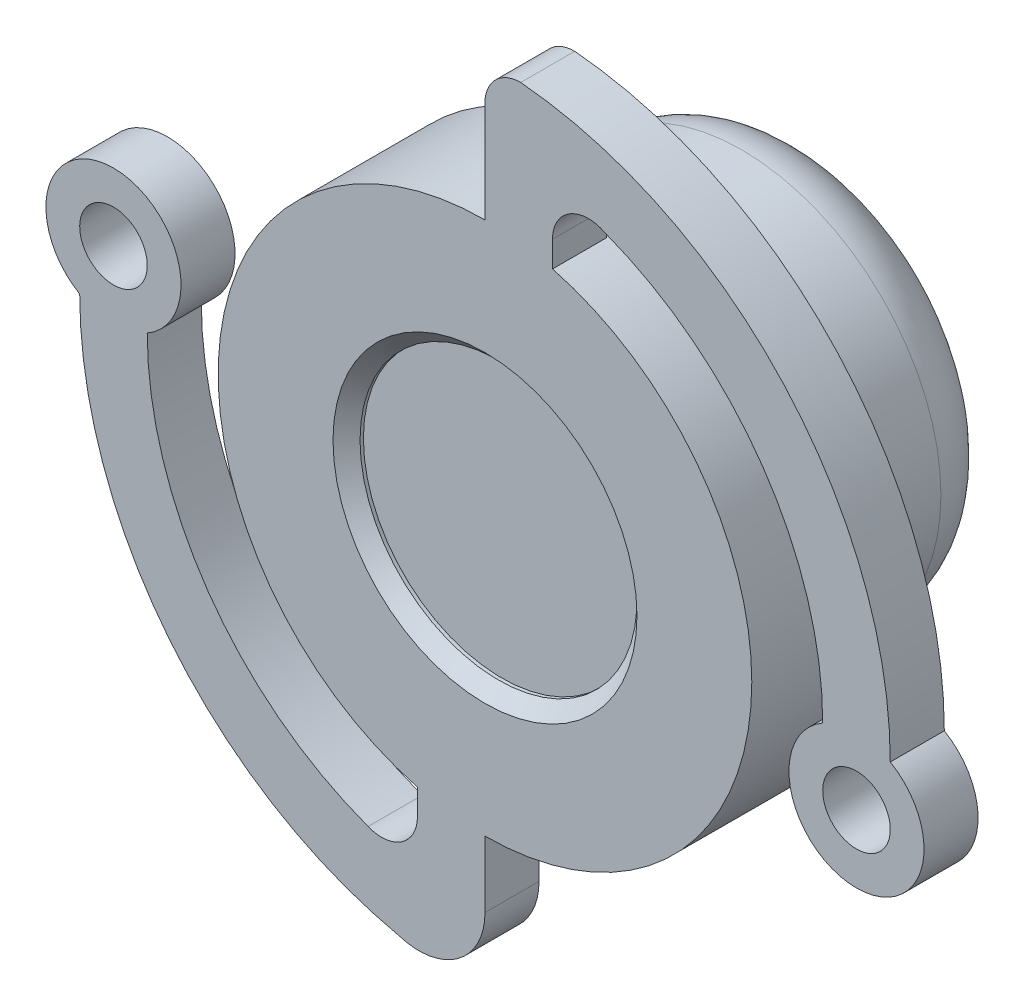
ISO-10303-21;
HEADER;
FILE_DESCRIPTION(('STEP AP214'),'2;1');
FILE_NAME('part.step','',(''),(''),'','','');
FILE_SCHEMA(('AUTOMOTIVE_DESIGN { 1 0 10303 214 1 1 1 1 }'));
ENDSEC;
DATA;
#1=APPLICATION_CONTEXT('core data for automotive mechanical design processes');
#2=APPLICATION_PROTOCOL_DEFINITION('international standard','automotive_design',2000,#1);
#3=PRODUCT_CONTEXT('',#1,'mechanical');
#4=PRODUCT('Part','Part','',(#3));
#5=PRODUCT_RELATED_PRODUCT_CATEGORY('part','',(#4));
#6=PRODUCT_DEFINITION_FORMATION('','',#4);
#7=PRODUCT_DEFINITION_CONTEXT('part definition',#1,'design');
#8=PRODUCT_DEFINITION('design','',#6,#7);
#9=PRODUCT_DEFINITION_SHAPE('','',#8);
#10=(LENGTH_UNIT() NAMED_UNIT(*) SI_UNIT(.MILLI.,.METRE.));
#11=(NAMED_UNIT(*) PLANE_ANGLE_UNIT() SI_UNIT($,.RADIAN.));
#12=(NAMED_UNIT(*) SI_UNIT($,.STERADIAN.) SOLID_ANGLE_UNIT());
#13=UNCERTAINTY_MEASURE_WITH_UNIT(LENGTH_MEASURE(1.E-05),#10,'distance_accuracy_value','');
#14=(GEOMETRIC_REPRESENTATION_CONTEXT(3) GLOBAL_UNCERTAINTY_ASSIGNED_CONTEXT((#13)) GLOBAL_UNIT_ASSIGNED_CONTEXT((#10,
#11,#12)) REPRESENTATION_CONTEXT('',''));
#15=CARTESIAN_POINT('',(0.,0.,0.));
#16=DIRECTION('',(0.,0.,1.));
#17=DIRECTION('',(1.,0.,0.));
#18=AXIS2_PLACEMENT_3D('',#15,#16,#17);
#19=CARTESIAN_POINT('',(12.966856851689,27.5174833037251,-8.12700712680798));
#20=DIRECTION('',(0.,1.31134157754799E-07,-1.));
#21=DIRECTION('',(-1.,0.,0.));
#22=AXIS2_PLACEMENT_3D('',#19,#20,#21);
#23=PLANE('',#22);
#24=CARTESIAN_POINT('',(12.966856851689,27.5174830414568,-8.12700712680801));
#25=DIRECTION('',(0.,-1.31134157754799E-07,1.));
#26=DIRECTION('',(-1.,0.,0.));
#27=AXIS2_PLACEMENT_3D('',#24,#25,#26);
#28=CIRCLE('',#27,2.95);
#29=CARTESIAN_POINT('',(15.916856851689,27.5174830414568,-8.12700712680801));
#30=VERTEX_POINT('',#29);
#31=EDGE_CURVE('E339',#30,#30,#28,.T.);
#32=ORIENTED_EDGE('',*,*,#31,.T.);
#33=EDGE_LOOP('',(#32));
#34=FACE_BOUND('',#33,.T.);
#35=CARTESIAN_POINT('',(12.966856851689,27.5174833037251,-8.12700712680798));
#36=DIRECTION('',(0.,1.31134157754799E-07,-1.));
#37=DIRECTION('',(-1.,0.,0.));
#38=AXIS2_PLACEMENT_3D('',#35,#36,#37);
#39=CIRCLE('',#38,3.95000001490116);
#40=CARTESIAN_POINT('',(16.9168568665902,27.5174833037251,-8.12700712680798));
#41=VERTEX_POINT('',#40);
#42=EDGE_CURVE('E350',#41,#41,#39,.T.);
#43=ORIENTED_EDGE('',*,*,#42,.T.);
#44=EDGE_LOOP('',(#43));
#45=FACE_BOUND('',#44,.T.);
#46=ADVANCED_FACE('F47',(#34,#45),#23,.T.);
#47=CARTESIAN_POINT('',(12.966856851689,27.5174831070239,-6.62700712680799));
#48=DIRECTION('',(0.,1.31134158346905E-07,-1.));
#49=DIRECTION('',(-1.,0.,0.));
#50=AXIS2_PLACEMENT_3D('',#47,#48,#49);
#51=CYLINDRICAL_SURFACE('',#50,3.95000001490116);
#52=DIRECTION('',(0.,-1.31134157754798E-07,0.999999999999992));
#53=VECTOR('',#52,1.);
#54=CARTESIAN_POINT('',(11.966856851689,23.6961613701041,-6.92700762791381));
#55=LINE('',#54,#53);
#56=CARTESIAN_POINT('',(11.966856851689,23.6961613701041,-6.92700762791381));
#57=VERTEX_POINT('',#56);
#58=CARTESIAN_POINT('',(11.966856851689,23.6961612651968,-6.12700762791382));
#59=VERTEX_POINT('',#58);
#60=EDGE_CURVE('E385',#57,#59,#55,.T.);
#61=ORIENTED_EDGE('',*,*,#60,.T.);
#62=CARTESIAN_POINT('',(12.966856851689,27.5174830414568,-6.127007126808));
#63=DIRECTION('',(0.,-1.31134157754799E-07,1.));
#64=DIRECTION('',(-1.,0.,0.));
#65=AXIS2_PLACEMENT_3D('',#62,#63,#64);
#66=CIRCLE('',#65,3.95000001490116);
#67=CARTESIAN_POINT('',(12.966856851689,31.4674830563579,-6.12700660882807));
#68=VERTEX_POINT('',#67);
#69=EDGE_CURVE('E363',#68,#59,#66,.T.);
#70=ORIENTED_EDGE('',*,*,#69,.F.);
#71=DIRECTION('',(0.,-1.31134157754798E-07,0.999999999999992));
#72=VECTOR('',#71,1.);
#73=CARTESIAN_POINT('',(12.966856851689,31.4674831612653,-6.92700660882807));
#74=LINE('',#73,#72);
#75=CARTESIAN_POINT('',(12.966856851689,31.4674831612653,-6.92700660882807));
#76=VERTEX_POINT('',#75);
#77=EDGE_CURVE('E311',#76,#68,#74,.T.);
#78=ORIENTED_EDGE('',*,*,#77,.F.);
#79=CARTESIAN_POINT('',(12.966856851689,27.5174831463641,-6.92700712680799));
#80=DIRECTION('',(0.,1.31134157754798E-07,-0.999999999999991));
#81=DIRECTION('',(0.,0.999999999999991,1.31134157754798E-07));
#82=AXIS2_PLACEMENT_3D('',#79,#80,#81);
#83=CIRCLE('',#82,3.95000001490124);
#84=CARTESIAN_POINT('',(13.966856851689,31.3388049226242,-6.92700662570218));
#85=VERTEX_POINT('',#84);
#86=EDGE_CURVE('E272',#76,#85,#83,.T.);
#87=ORIENTED_EDGE('',*,*,#86,.T.);
#88=DIRECTION('',(0.,-1.31134157754798E-07,0.999999999999992));
#89=VECTOR('',#88,1.);
#90=CARTESIAN_POINT('',(13.966856851689,31.3388049226242,-6.92700662570218));
#91=LINE('',#90,#89);
#92=CARTESIAN_POINT('',(13.966856851689,31.3388048177169,-6.12700662570219));
#93=VERTEX_POINT('',#92);
#94=EDGE_CURVE('E308',#85,#93,#91,.T.);
#95=ORIENTED_EDGE('',*,*,#94,.T.);
#96=CARTESIAN_POINT('',(16.9168568665902,27.5174830414568,-6.127007126808));
#97=VERTEX_POINT('',#96);
#98=EDGE_CURVE('E360',#97,#93,#66,.T.);
#99=ORIENTED_EDGE('',*,*,#98,.F.);
#100=DIRECTION('',(0.,-1.31134158346905E-07,1.));
#101=VECTOR('',#100,1.);
#102=CARTESIAN_POINT('',(16.9168568665902,27.5174831070239,-6.62700712680799));
#103=LINE('',#102,#101);
#104=EDGE_CURVE('E55',#41,#97,#103,.T.);
#105=ORIENTED_EDGE('',*,*,#104,.F.);
#106=ORIENTED_EDGE('',*,*,#42,.F.);
#107=ORIENTED_EDGE('',*,*,#104,.T.);
#108=CARTESIAN_POINT('',(12.9668568516884,23.5674830265556,-6.12700764478793));
#109=VERTEX_POINT('',#108);
#110=EDGE_CURVE('E359',#109,#97,#66,.T.);
#111=ORIENTED_EDGE('',*,*,#110,.F.);
#112=DIRECTION('',(0.,-1.31134157754798E-07,0.999999999999992));
#113=VECTOR('',#112,1.);
#114=CARTESIAN_POINT('',(12.966856851689,23.567483131463,-6.92700764478792));
#115=LINE('',#114,#113);
#116=CARTESIAN_POINT('',(12.966856851689,23.567483131463,-6.92700764478792));
#117=VERTEX_POINT('',#116);
#118=EDGE_CURVE('E388',#117,#109,#115,.T.);
#119=ORIENTED_EDGE('',*,*,#118,.F.);
#120=CARTESIAN_POINT('',(12.966856851689,27.5174831463641,-6.92700712680799));
#121=DIRECTION('',(0.,1.31134157754798E-07,-0.999999999999991));
#122=DIRECTION('',(0.,0.999999999999991,1.31134157754798E-07));
#123=AXIS2_PLACEMENT_3D('',#120,#121,#122);
#124=CIRCLE('',#123,3.95000001490116);
#125=EDGE_CURVE('E11',#57,#117,#124,.F.);
#126=ORIENTED_EDGE('',*,*,#125,.F.);
#127=EDGE_LOOP('',(#61,#70,#78,#87,#95,#99,#105,#106,#107,#111,#119,#126));
#128=FACE_BOUND('',#127,.T.);
#129=ADVANCED_FACE('F372',(#128),#51,.T.);
#130=CARTESIAN_POINT('',(12.966856851689,27.5174833233952,-6.37700712680796));
#131=DIRECTION('',(0.,-1.31134157754799E-07,1.));
#132=DIRECTION('',(-1.,0.,0.));
#133=AXIS2_PLACEMENT_3D('',#130,#131,#132);
#134=PLANE('',#133);
#135=CARTESIAN_POINT('',(12.966856851689,27.5174833233952,-6.37700712680796));
#136=DIRECTION('',(0.,1.31134157754799E-07,-1.));
#137=DIRECTION('',(1.,0.,0.));
#138=AXIS2_PLACEMENT_3D('',#135,#136,#137);
#139=CIRCLE('',#138,2.05);
#140=CARTESIAN_POINT('',(10.916856851689,27.5174833233952,-6.37700712680796));
#141=VERTEX_POINT('',#140);
#142=EDGE_CURVE('E322',#141,#141,#139,.T.);
#143=ORIENTED_EDGE('',*,*,#142,.F.);
#144=EDGE_LOOP('',(#143));
#145=FACE_BOUND('',#144,.T.);
#146=ADVANCED_FACE('F49',(#145),#134,.T.);
#147=CARTESIAN_POINT('',(12.966856851689,27.5174830414568,-6.127007126808));
#148=DIRECTION('',(0.,1.31134157754799E-07,-1.));
#149=DIRECTION('',(-1.,0.,0.));
#150=AXIS2_PLACEMENT_3D('',#147,#148,#149);
#151=PLANE('',#150);
#152=CARTESIAN_POINT('',(12.966856851689,27.5174832906117,-6.12700712680796));
#153=DIRECTION('',(0.,-1.31134157754799E-07,1.));
#154=DIRECTION('',(1.,0.,0.));
#155=AXIS2_PLACEMENT_3D('',#152,#153,#154);
#156=CIRCLE('',#155,2.25);
#157=CARTESIAN_POINT('',(10.716856851689,27.5174832906117,-6.12700712680796));
#158=VERTEX_POINT('',#157);
#159=EDGE_CURVE('E342',#158,#158,#156,.T.);
#160=ORIENTED_EDGE('',*,*,#159,.F.);
#161=EDGE_LOOP('',(#160));
#162=FACE_BOUND('',#161,.T.);
#163=ORIENTED_EDGE('',*,*,#69,.T.);
#164=DIRECTION('',(0.,-0.999999999999991,-1.3113415668214E-07));
#165=VECTOR('',#164,1.);
#166=CARTESIAN_POINT('',(11.966856851689,23.6961612651968,-6.12700762791382));
#167=LINE('',#166,#165);
#168=CARTESIAN_POINT('',(11.966856851689,23.3171314711586,-6.12700767761757));
#169=VERTEX_POINT('',#168);
#170=EDGE_CURVE('E228',#59,#169,#167,.T.);
#171=ORIENTED_EDGE('',*,*,#170,.T.);
#172=CARTESIAN_POINT('',(11.436856851689,23.3171314711586,-6.12700767761757));
#173=DIRECTION('',(0.,1.31134157754798E-07,-0.999999999999991));
#174=DIRECTION('',(0.,0.999999999999991,1.31134157754798E-07));
#175=AXIS2_PLACEMENT_3D('',#172,#173,#174);
#176=CIRCLE('',#175,0.53);
#177=CARTESIAN_POINT('',(11.2369889405969,22.8262620199644,-6.12700774198732));
#178=VERTEX_POINT('',#177);
#179=EDGE_CURVE('E225',#169,#178,#176,.T.);
#180=ORIENTED_EDGE('',*,*,#179,.T.);
#181=CARTESIAN_POINT('',(12.966856851689,27.5174832906117,-6.12700712680797));
#182=DIRECTION('',(0.,1.31134157754798E-07,-0.999999999999991));
#183=DIRECTION('',(0.,0.999999999999991,1.31134157754798E-07));
#184=AXIS2_PLACEMENT_3D('',#181,#182,#183);
#185=CIRCLE('',#184,5.00000000000001);
#186=CARTESIAN_POINT('',(7.96685685168899,27.5174832906117,-6.12700712680797));
#187=VERTEX_POINT('',#186);
#188=EDGE_CURVE('E218',#178,#187,#185,.T.);
#189=ORIENTED_EDGE('',*,*,#188,.T.);
#190=CARTESIAN_POINT('',(7.466856851689,28.3835086943961,-6.12700701324246));
#191=DIRECTION('',(0.,-1.31134157754798E-07,0.999999999999991));
#192=DIRECTION('',(0.,0.999999999999991,1.31134157754798E-07));
#193=AXIS2_PLACEMENT_3D('',#190,#191,#192);
#194=CIRCLE('',#193,0.999999999999999);
#195=CARTESIAN_POINT('',(6.966856851689,27.5174832906117,-6.12700712680797));
#196=VERTEX_POINT('',#195);
#197=EDGE_CURVE('E215',#187,#196,#194,.T.);
#198=ORIENTED_EDGE('',*,*,#197,.T.);
#199=CARTESIAN_POINT('',(12.966856851689,27.5174832906117,-6.12700712680797));
#200=DIRECTION('',(0.,-1.31134157754798E-07,0.999999999999991));
#201=DIRECTION('',(0.,0.999999999999991,1.31134157754798E-07));
#202=AXIS2_PLACEMENT_3D('',#199,#200,#201);
#203=CIRCLE('',#202,6.);
#204=CARTESIAN_POINT('',(11.6901438715171,21.6548896695034,-6.12700789559425));
#205=VERTEX_POINT('',#204);
#206=EDGE_CURVE('E197',#196,#205,#203,.T.);
#207=ORIENTED_EDGE('',*,*,#206,.T.);
#208=CARTESIAN_POINT('',(11.988315664118,22.5868963421565,-6.12700777337634));
#209=DIRECTION('',(0.,-1.31134157754798E-07,0.999999999999991));
#210=DIRECTION('',(0.,0.999999999999991,1.31134157754798E-07));
#211=AXIS2_PLACEMENT_3D('',#208,#209,#210);
#212=CIRCLE('',#211,0.978541187570968);
#213=CARTESIAN_POINT('',(12.966856851689,22.5868963421565,-6.12700777337634));
#214=VERTEX_POINT('',#213);
#215=EDGE_CURVE('E205',#205,#214,#212,.T.);
#216=ORIENTED_EDGE('',*,*,#215,.T.);
#217=DIRECTION('',(0.,0.999999999999991,1.3113415780958E-07));
#218=VECTOR('',#217,1.);
#219=CARTESIAN_POINT('',(12.966856851689,23.5674830265556,-6.12700764478793));
#220=LINE('',#219,#218);
#221=EDGE_CURVE('E62',#214,#109,#220,.T.);
#222=ORIENTED_EDGE('',*,*,#221,.T.);
#223=ORIENTED_EDGE('',*,*,#110,.T.);
#224=ORIENTED_EDGE('',*,*,#98,.T.);
#225=DIRECTION('',(0.,0.999999999999991,1.3113415812003E-07));
#226=VECTOR('',#225,1.);
#227=CARTESIAN_POINT('',(13.966856851689,31.3388048177169,-6.12700662570219));
#228=LINE('',#227,#226);
#229=CARTESIAN_POINT('',(13.966856851689,31.7208679756418,-6.12700657560066));
#230=VERTEX_POINT('',#229);
#231=EDGE_CURVE('E293',#93,#230,#228,.T.);
#232=ORIENTED_EDGE('',*,*,#231,.T.);
#233=CARTESIAN_POINT('',(14.496856851689,31.7208679756418,-6.12700657560066));
#234=DIRECTION('',(0.,1.31134157754798E-07,-0.999999999999991));
#235=DIRECTION('',(0.,0.999999999999991,1.31134157754798E-07));
#236=AXIS2_PLACEMENT_3D('',#233,#234,#235);
#237=CIRCLE('',#236,0.529999999999999);
#238=CARTESIAN_POINT('',(14.7345169129555,32.1945954239481,-6.12700651347881));
#239=VERTEX_POINT('',#238);
#240=EDGE_CURVE('E296',#230,#239,#237,.T.);
#241=ORIENTED_EDGE('',*,*,#240,.T.);
#242=CARTESIAN_POINT('',(12.966856851689,27.5174832906117,-6.12700712680797));
#243=DIRECTION('',(0.,1.31134157754798E-07,-0.999999999999991));
#244=DIRECTION('',(0.,-0.999999999999991,-1.31134157754798E-07));
#245=AXIS2_PLACEMENT_3D('',#242,#243,#244);
#246=CIRCLE('',#245,5.);
#247=CARTESIAN_POINT('',(17.966856851689,27.5174832906117,-6.12700712680797));
#248=VERTEX_POINT('',#247);
#249=EDGE_CURVE('E263',#239,#248,#246,.T.);
#250=ORIENTED_EDGE('',*,*,#249,.T.);
#251=CARTESIAN_POINT('',(18.466856851689,26.6514578868273,-6.12700724037348));
#252=DIRECTION('',(0.,-1.31134157754798E-07,0.999999999999991));
#253=DIRECTION('',(0.,-0.999999999999991,-1.31134157754798E-07));
#254=AXIS2_PLACEMENT_3D('',#251,#252,#253);
#255=CIRCLE('',#254,1.);
#256=CARTESIAN_POINT('',(18.966856851689,27.5174832906117,-6.12700712680797));
#257=VERTEX_POINT('',#256);
#258=EDGE_CURVE('E256',#248,#257,#255,.T.);
#259=ORIENTED_EDGE('',*,*,#258,.T.);
#260=CARTESIAN_POINT('',(12.966856851689,27.5174832906117,-6.12700712680797));
#261=DIRECTION('',(0.,-1.31134157754798E-07,0.999999999999991));
#262=DIRECTION('',(0.,0.999999999999991,1.31134157754798E-07));
#263=AXIS2_PLACEMENT_3D('',#260,#261,#262);
#264=CIRCLE('',#263,6.00000000000001);
#265=CARTESIAN_POINT('',(13.4958116735164,33.4941217100299,-6.12700634306652));
#266=VERTEX_POINT('',#265);
#267=EDGE_CURVE('E287',#257,#266,#264,.T.);
#268=ORIENTED_EDGE('',*,*,#267,.T.);
#269=CARTESIAN_POINT('',(13.4935005763374,32.967483056358,-6.12700641212684));
#270=DIRECTION('',(0.,-1.31134157754798E-07,0.999999999999991));
#271=DIRECTION('',(0.,0.999999999999991,1.31134157754798E-07));
#272=AXIS2_PLACEMENT_3D('',#269,#270,#271);
#273=CIRCLE('',#272,0.526643724648376);
#274=CARTESIAN_POINT('',(12.966856851689,32.967483056358,-6.12700641212684));
#275=VERTEX_POINT('',#274);
#276=EDGE_CURVE('E290',#266,#275,#273,.T.);
#277=ORIENTED_EDGE('',*,*,#276,.T.);
#278=DIRECTION('',(0.,-0.999999999999991,-1.31134157930572E-07));
#279=VECTOR('',#278,1.);
#280=CARTESIAN_POINT('',(12.966856851689,31.467483056358,-6.12700660882808));
#281=LINE('',#280,#279);
#282=EDGE_CURVE('E69',#275,#68,#281,.T.);
#283=ORIENTED_EDGE('',*,*,#282,.T.);
#284=EDGE_LOOP('',(#163,#171,#180,#189,#198,#207,#216,#222,#223,#224,#232,#241,#250,#259,#268,
#277,#283));
#285=FACE_BOUND('',#284,.T.);
#286=CARTESIAN_POINT('',(18.466856851689,26.6514578868273,-6.12700724037348));
#287=DIRECTION('',(0.,-1.31134157754798E-07,0.999999999999991));
#288=DIRECTION('',(0.,-0.999999999999991,-1.31134157754798E-07));
#289=AXIS2_PLACEMENT_3D('',#286,#287,#288);
#290=CIRCLE('',#289,0.500000000000003);
#291=CARTESIAN_POINT('',(18.466856851689,26.1514578868273,-6.12700730594056));
#292=VERTEX_POINT('',#291);
#293=EDGE_CURVE('E250',#292,#292,#290,.T.);
#294=ORIENTED_EDGE('',*,*,#293,.F.);
#295=EDGE_LOOP('',(#294));
#296=FACE_BOUND('',#295,.T.);
#297=CARTESIAN_POINT('',(7.466856851689,28.3835086943961,-6.12700701324246));
#298=DIRECTION('',(0.,-1.31134157754798E-07,0.999999999999991));
#299=DIRECTION('',(0.,-0.999999999999991,-1.31134157754798E-07));
#300=AXIS2_PLACEMENT_3D('',#297,#298,#299);
#301=CIRCLE('',#300,0.5);
#302=CARTESIAN_POINT('',(7.466856851689,27.8835086943961,-6.12700707880954));
#303=VERTEX_POINT('',#302);
#304=EDGE_CURVE('E247',#303,#303,#301,.T.);
#305=ORIENTED_EDGE('',*,*,#304,.F.);
#306=EDGE_LOOP('',(#305));
#307=FACE_BOUND('',#306,.T.);
#308=ADVANCED_FACE('F211',(#162,#285,#296,#307),#151,.F.);
#309=CARTESIAN_POINT('',(12.966856851689,27.5174832906117,-6.12700712680796));
#310=DIRECTION('',(0.,1.311341613075E-07,-1.));
#311=DIRECTION('',(1.,0.,0.));
#312=AXIS2_PLACEMENT_3D('',#309,#310,#311);
#313=CYLINDRICAL_SURFACE('',#312,2.05);
#314=CARTESIAN_POINT('',(12.966856851689,27.5174833168385,-6.32700712680796));
#315=DIRECTION('',(0.,1.31134157754799E-07,-1.));
#316=DIRECTION('',(1.,0.,0.));
#317=AXIS2_PLACEMENT_3D('',#314,#315,#316);
#318=CIRCLE('',#317,2.05);
#319=CARTESIAN_POINT('',(10.916856851689,27.5174833168385,-6.32700712680796));
#320=VERTEX_POINT('',#319);
#321=EDGE_CURVE('E323',#320,#320,#318,.T.);
#322=ORIENTED_EDGE('',*,*,#321,.F.);
#323=DIRECTION('',(0.,1.311341613075E-07,-1.));
#324=VECTOR('',#323,1.);
#325=CARTESIAN_POINT('',(10.916856851689,27.5174832906117,-6.12700712680796));
#326=LINE('',#325,#324);
#327=EDGE_CURVE('E318',#320,#141,#326,.T.);
#328=ORIENTED_EDGE('',*,*,#327,.T.);
#329=ORIENTED_EDGE('',*,*,#142,.T.);
#330=ORIENTED_EDGE('',*,*,#327,.F.);
#331=EDGE_LOOP('',(#322,#328,#329,#330));
#332=FACE_BOUND('',#331,.T.);
#333=ADVANCED_FACE('F442',(#332),#313,.F.);
#334=CARTESIAN_POINT('',(12.966856851689,27.5174833037251,-6.22700712680796));
#335=DIRECTION('',(0.,-1.31134147984824E-07,1.));
#336=DIRECTION('',(1.,0.,0.));
#337=AXIS2_PLACEMENT_3D('',#334,#335,#336);
#338=CONICAL_SURFACE('',#337,2.15,0.78539816339745);
#339=ORIENTED_EDGE('',*,*,#159,.T.);
#340=DIRECTION('',(0.707106781186548,9.27258453717848E-08,-0.707106781186541));
#341=VECTOR('',#340,1.);
#342=CARTESIAN_POINT('',(10.816856851689,27.5174833037251,-6.22700712680796));
#343=LINE('',#342,#341);
#344=EDGE_CURVE('E346',#158,#320,#343,.T.);
#345=ORIENTED_EDGE('',*,*,#344,.T.);
#346=ORIENTED_EDGE('',*,*,#321,.T.);
#347=ORIENTED_EDGE('',*,*,#344,.F.);
#348=EDGE_LOOP('',(#339,#345,#346,#347));
#349=FACE_BOUND('',#348,.T.);
#350=ADVANCED_FACE('F439',(#349),#338,.F.);
#351=CARTESIAN_POINT('',(12.966856851689,27.5174834086325,-10.927007126808));
#352=DIRECTION('',(0.,1.31134157754799E-07,-1.));
#353=DIRECTION('',(-1.,0.,0.));
#354=AXIS2_PLACEMENT_3D('',#351,#352,#353);
#355=PLANE('',#354);
#356=CARTESIAN_POINT('',(12.966856851689,27.5174834086325,-10.927007126808));
#357=DIRECTION('',(0.,-1.31134157754799E-07,1.));
#358=DIRECTION('',(-1.,0.,0.));
#359=AXIS2_PLACEMENT_3D('',#356,#357,#358);
#360=CIRCLE('',#359,1.95);
#361=CARTESIAN_POINT('',(14.916856851689,27.5174834086325,-10.927007126808));
#362=VERTEX_POINT('',#361);
#363=EDGE_CURVE('E303',#362,#362,#360,.T.);
#364=ORIENTED_EDGE('',*,*,#363,.F.);
#365=EDGE_LOOP('',(#364));
#366=FACE_BOUND('',#365,.T.);
#367=ADVANCED_FACE('F437',(#366),#355,.T.);
#368=CARTESIAN_POINT('',(12.966856851689,27.5174830414568,-8.12700712680801));
#369=DIRECTION('',(0.,1.31134157501021E-07,-1.));
#370=DIRECTION('',(-1.,0.,0.));
#371=AXIS2_PLACEMENT_3D('',#368,#369,#370);
#372=CYLINDRICAL_SURFACE('',#371,2.95);
#373=CARTESIAN_POINT('',(12.966856851689,27.5174832774983,-9.927007126808));
#374=DIRECTION('',(0.,1.31134157754799E-07,-1.));
#375=DIRECTION('',(-1.,0.,0.));
#376=AXIS2_PLACEMENT_3D('',#373,#374,#375);
#377=CIRCLE('',#376,2.95);
#378=CARTESIAN_POINT('',(15.916856851689,27.5174832774983,-9.927007126808));
#379=VERTEX_POINT('',#378);
#380=EDGE_CURVE('E331',#379,#379,#377,.T.);
#381=ORIENTED_EDGE('',*,*,#380,.F.);
#382=DIRECTION('',(0.,-1.31134157501021E-07,1.));
#383=VECTOR('',#382,1.);
#384=CARTESIAN_POINT('',(15.916856851689,27.5174830414568,-8.12700712680801));
#385=LINE('',#384,#383);
#386=EDGE_CURVE('E335',#379,#30,#385,.T.);
#387=ORIENTED_EDGE('',*,*,#386,.T.);
#388=ORIENTED_EDGE('',*,*,#31,.F.);
#389=ORIENTED_EDGE('',*,*,#386,.F.);
#390=EDGE_LOOP('',(#381,#387,#388,#389));
#391=FACE_BOUND('',#390,.T.);
#392=ADVANCED_FACE('F434',(#391),#372,.T.);
#393=CARTESIAN_POINT('',(12.966856851689,27.5174832774983,-9.927007126808));
#394=DIRECTION('',(0.,1.31134157754799E-07,-1.));
#395=DIRECTION('',(-1.,0.,0.));
#396=AXIS2_PLACEMENT_3D('',#393,#394,#395);
#397=TOROIDAL_SURFACE('',#396,1.95,1.);
#398=ORIENTED_EDGE('',*,*,#363,.T.);
#399=CARTESIAN_POINT('',(14.916856851689,27.5174832774983,-9.927007126808));
#400=DIRECTION('',(0.,-1.,-1.31134157754799E-07));
#401=DIRECTION('',(1.,0.,0.));
#402=AXIS2_PLACEMENT_3D('',#399,#400,#401);
#403=CIRCLE('',#402,1.);
#404=EDGE_CURVE('E327',#362,#379,#403,.T.);
#405=ORIENTED_EDGE('',*,*,#404,.T.);
#406=ORIENTED_EDGE('',*,*,#380,.T.);
#407=ORIENTED_EDGE('',*,*,#404,.F.);
#408=EDGE_LOOP('',(#398,#405,#406,#407));
#409=FACE_BOUND('',#408,.T.);
#410=ADVANCED_FACE('F432',(#409),#397,.T.);
#411=CARTESIAN_POINT('',(18.466856851689,26.6514579917346,-6.92700724037348));
#412=DIRECTION('',(0.,-1.31134157754798E-07,0.999999999999992));
#413=DIRECTION('',(0.,-0.999999999999992,-1.31134157754798E-07));
#414=AXIS2_PLACEMENT_3D('',#411,#412,#413);
#415=CYLINDRICAL_SURFACE('',#414,1.);
#416=ORIENTED_EDGE('',*,*,#258,.F.);
#417=DIRECTION('',(0.,-1.31134157754798E-07,0.999999999999992));
#418=VECTOR('',#417,1.);
#419=CARTESIAN_POINT('',(17.966856851689,27.517483395519,-6.92700712680796));
#420=LINE('',#419,#418);
#421=CARTESIAN_POINT('',(17.966856851689,27.517483395519,-6.92700712680796));
#422=VERTEX_POINT('',#421);
#423=EDGE_CURVE('E301',#422,#248,#420,.T.);
#424=ORIENTED_EDGE('',*,*,#423,.F.);
#425=CARTESIAN_POINT('',(18.466856851689,26.6514579917346,-6.92700724037348));
#426=DIRECTION('',(0.,-1.31134157754798E-07,0.999999999999991));
#427=DIRECTION('',(0.,-0.999999999999991,-1.31134157754798E-07));
#428=AXIS2_PLACEMENT_3D('',#425,#426,#427);
#429=CIRCLE('',#428,1.);
#430=CARTESIAN_POINT('',(18.966856851689,27.517483395519,-6.92700712680796));
#431=VERTEX_POINT('',#430);
#432=EDGE_CURVE('E259',#422,#431,#429,.T.);
#433=ORIENTED_EDGE('',*,*,#432,.T.);
#434=DIRECTION('',(0.,-1.31134157754798E-07,0.999999999999992));
#435=VECTOR('',#434,1.);
#436=CARTESIAN_POINT('',(18.966856851689,27.517483395519,-6.92700712680796));
#437=LINE('',#436,#435);
#438=EDGE_CURVE('E284',#431,#257,#437,.T.);
#439=ORIENTED_EDGE('',*,*,#438,.T.);
#440=EDGE_LOOP('',(#416,#424,#433,#439));
#441=FACE_BOUND('',#440,.T.);
#442=ADVANCED_FACE('F497',(#441),#415,.T.);
#443=CARTESIAN_POINT('',(12.966856851689,27.517483395519,-6.92700712680796));
#444=DIRECTION('',(0.,-1.31134157754798E-07,0.999999999999992));
#445=DIRECTION('',(0.,-0.999999999999992,-1.31134157754798E-07));
#446=AXIS2_PLACEMENT_3D('',#443,#444,#445);
#447=CYLINDRICAL_SURFACE('',#446,5.);
#448=ORIENTED_EDGE('',*,*,#249,.F.);
#449=DIRECTION('',(0.,-1.31134157754798E-07,0.999999999999992));
#450=VECTOR('',#449,1.);
#451=CARTESIAN_POINT('',(14.7345169129555,32.1945955288555,-6.9270065134788));
#452=LINE('',#451,#450);
#453=CARTESIAN_POINT('',(14.7345169129555,32.1945955288555,-6.9270065134788));
#454=VERTEX_POINT('',#453);
#455=EDGE_CURVE('E304',#454,#239,#452,.T.);
#456=ORIENTED_EDGE('',*,*,#455,.F.);
#457=CARTESIAN_POINT('',(12.966856851689,27.517483395519,-6.92700712680796));
#458=DIRECTION('',(0.,1.31134157754798E-07,-0.999999999999991));
#459=DIRECTION('',(0.,-0.999999999999991,-1.31134157754798E-07));
#460=AXIS2_PLACEMENT_3D('',#457,#458,#459);
#461=CIRCLE('',#460,5.);
#462=EDGE_CURVE('E281',#454,#422,#461,.T.);
#463=ORIENTED_EDGE('',*,*,#462,.T.);
#464=ORIENTED_EDGE('',*,*,#423,.T.);
#465=EDGE_LOOP('',(#448,#456,#463,#464));
#466=FACE_BOUND('',#465,.T.);
#467=ADVANCED_FACE('F602',(#466),#447,.F.);
#468=CARTESIAN_POINT('',(14.496856851689,31.7208680805492,-6.92700657560065));
#469=DIRECTION('',(0.,-1.31134157754798E-07,0.999999999999992));
#470=DIRECTION('',(0.,-0.999999999999992,-1.31134157754798E-07));
#471=AXIS2_PLACEMENT_3D('',#468,#469,#470);
#472=CYLINDRICAL_SURFACE('',#471,0.529999999999999);
#473=ORIENTED_EDGE('',*,*,#240,.F.);
#474=DIRECTION('',(0.,-1.31134157754798E-07,0.999999999999992));
#475=VECTOR('',#474,1.);
#476=CARTESIAN_POINT('',(13.966856851689,31.7208680805492,-6.92700657560065));
#477=LINE('',#476,#475);
#478=CARTESIAN_POINT('',(13.966856851689,31.7208680805492,-6.92700657560065));
#479=VERTEX_POINT('',#478);
#480=EDGE_CURVE('E306',#479,#230,#477,.T.);
#481=ORIENTED_EDGE('',*,*,#480,.F.);
#482=CARTESIAN_POINT('',(14.496856851689,31.7208680805492,-6.92700657560065));
#483=DIRECTION('',(0.,1.31134157754798E-07,-0.999999999999991));
#484=DIRECTION('',(0.,0.999999999999991,1.31134157754798E-07));
#485=AXIS2_PLACEMENT_3D('',#482,#483,#484);
#486=CIRCLE('',#485,0.529999999999999);
#487=EDGE_CURVE('E278',#479,#454,#486,.T.);
#488=ORIENTED_EDGE('',*,*,#487,.T.);
#489=ORIENTED_EDGE('',*,*,#455,.T.);
#490=EDGE_LOOP('',(#473,#481,#488,#489));
#491=FACE_BOUND('',#490,.T.);
#492=ADVANCED_FACE('F612',(#491),#472,.F.);
#493=CARTESIAN_POINT('',(13.966856851689,31.3388049226242,-6.92700662570218));
#494=DIRECTION('',(1.,0.,0.));
#495=DIRECTION('',(0.,0.,-1.));
#496=AXIS2_PLACEMENT_3D('',#493,#494,#495);
#497=PLANE('',#496);
#498=ORIENTED_EDGE('',*,*,#231,.F.);
#499=ORIENTED_EDGE('',*,*,#94,.F.);
#500=DIRECTION('',(0.,0.999999999999991,1.3113415812003E-07));
#501=VECTOR('',#500,1.);
#502=CARTESIAN_POINT('',(13.966856851689,31.3388049226242,-6.92700662570218));
#503=LINE('',#502,#501);
#504=EDGE_CURVE('E275',#85,#479,#503,.T.);
#505=ORIENTED_EDGE('',*,*,#504,.T.);
#506=ORIENTED_EDGE('',*,*,#480,.T.);
#507=EDGE_LOOP('',(#498,#499,#505,#506));
#508=FACE_BOUND('',#507,.T.);
#509=ADVANCED_FACE('F622',(#508),#497,.T.);
#510=CARTESIAN_POINT('',(12.966856851689,31.4674831612653,-6.92700660882807));
#511=DIRECTION('',(-1.,0.,0.));
#512=DIRECTION('',(0.,-1.,0.));
#513=AXIS2_PLACEMENT_3D('',#510,#511,#512);
#514=PLANE('',#513);
#515=ORIENTED_EDGE('',*,*,#282,.F.);
#516=DIRECTION('',(0.,-1.31134157754798E-07,0.999999999999992));
#517=VECTOR('',#516,1.);
#518=CARTESIAN_POINT('',(12.966856851689,32.9674831612653,-6.92700641212683));
#519=LINE('',#518,#517);
#520=CARTESIAN_POINT('',(12.966856851689,32.9674831612653,-6.92700641212683));
#521=VERTEX_POINT('',#520);
#522=EDGE_CURVE('E313',#521,#275,#519,.T.);
#523=ORIENTED_EDGE('',*,*,#522,.F.);
#524=DIRECTION('',(0.,-0.999999999999991,-1.31134157930572E-07));
#525=VECTOR('',#524,1.);
#526=CARTESIAN_POINT('',(12.966856851689,31.4674831612653,-6.92700660882807));
#527=LINE('',#526,#525);
#528=EDGE_CURVE('E269',#521,#76,#527,.T.);
#529=ORIENTED_EDGE('',*,*,#528,.T.);
#530=ORIENTED_EDGE('',*,*,#77,.T.);
#531=EDGE_LOOP('',(#515,#523,#529,#530));
#532=FACE_BOUND('',#531,.T.);
#533=ADVANCED_FACE('F632',(#532),#514,.T.);
#534=CARTESIAN_POINT('',(13.4935005763374,32.9674831612653,-6.92700641212683));
#535=DIRECTION('',(0.,-1.31134157754798E-07,0.999999999999992));
#536=DIRECTION('',(0.,-0.999999999999992,-1.31134157754798E-07));
#537=AXIS2_PLACEMENT_3D('',#534,#535,#536);
#538=CYLINDRICAL_SURFACE('',#537,0.526643724648376);
#539=ORIENTED_EDGE('',*,*,#276,.F.);
#540=DIRECTION('',(0.,-1.31134157754798E-07,0.999999999999992));
#541=VECTOR('',#540,1.);
#542=CARTESIAN_POINT('',(13.4958116735164,33.4941218149372,-6.92700634306652));
#543=LINE('',#542,#541);
#544=CARTESIAN_POINT('',(13.4958116735164,33.4941218149372,-6.92700634306652));
#545=VERTEX_POINT('',#544);
#546=EDGE_CURVE('E315',#545,#266,#543,.T.);
#547=ORIENTED_EDGE('',*,*,#546,.F.);
#548=CARTESIAN_POINT('',(13.4935005763374,32.9674831612653,-6.92700641212683));
#549=DIRECTION('',(0.,-1.31134157754798E-07,0.999999999999991));
#550=DIRECTION('',(0.,0.999999999999991,1.31134157754798E-07));
#551=AXIS2_PLACEMENT_3D('',#548,#549,#550);
#552=CIRCLE('',#551,0.526643724648376);
#553=EDGE_CURVE('E266',#545,#521,#552,.T.);
#554=ORIENTED_EDGE('',*,*,#553,.T.);
#555=ORIENTED_EDGE('',*,*,#522,.T.);
#556=EDGE_LOOP('',(#539,#547,#554,#555));
#557=FACE_BOUND('',#556,.T.);
#558=ADVANCED_FACE('F642',(#557),#538,.T.);
#559=CARTESIAN_POINT('',(12.966856851689,27.517483395519,-6.92700712680796));
#560=DIRECTION('',(0.,-1.31134157754798E-07,0.999999999999992));
#561=DIRECTION('',(0.,-0.999999999999992,-1.31134157754798E-07));
#562=AXIS2_PLACEMENT_3D('',#559,#560,#561);
#563=CYLINDRICAL_SURFACE('',#562,6.00000000000001);
#564=ORIENTED_EDGE('',*,*,#267,.F.);
#565=ORIENTED_EDGE('',*,*,#438,.F.);
#566=CARTESIAN_POINT('',(12.966856851689,27.517483395519,-6.92700712680796));
#567=DIRECTION('',(0.,-1.31134157754798E-07,0.999999999999991));
#568=DIRECTION('',(0.,0.999999999999991,1.31134157754798E-07));
#569=AXIS2_PLACEMENT_3D('',#566,#567,#568);
#570=CIRCLE('',#569,6.00000000000001);
#571=EDGE_CURVE('E262',#431,#545,#570,.T.);
#572=ORIENTED_EDGE('',*,*,#571,.T.);
#573=ORIENTED_EDGE('',*,*,#546,.T.);
#574=EDGE_LOOP('',(#564,#565,#572,#573));
#575=FACE_BOUND('',#574,.T.);
#576=ADVANCED_FACE('F652',(#575),#563,.T.);
#577=CARTESIAN_POINT('',(18.466856851689,26.6514579917346,-6.92700724037348));
#578=DIRECTION('',(0.,-1.31134157754798E-07,0.999999999999991));
#579=DIRECTION('',(0.,-0.999999999999991,-1.31134157754798E-07));
#580=AXIS2_PLACEMENT_3D('',#577,#578,#579);
#581=PLANE('',#580);
#582=CARTESIAN_POINT('',(18.466856851689,26.6514579917346,-6.92700724037348));
#583=DIRECTION('',(0.,-1.31134157754798E-07,0.999999999999991));
#584=DIRECTION('',(0.,-0.999999999999991,-1.31134157754798E-07));
#585=AXIS2_PLACEMENT_3D('',#582,#583,#584);
#586=CIRCLE('',#585,0.500000000000003);
#587=CARTESIAN_POINT('',(18.466856851689,26.1514579917346,-6.92700730594055));
#588=VERTEX_POINT('',#587);
#589=EDGE_CURVE('E253',#588,#588,#586,.T.);
#590=ORIENTED_EDGE('',*,*,#589,.T.);
#591=EDGE_LOOP('',(#590));
#592=FACE_BOUND('',#591,.T.);
#593=ORIENTED_EDGE('',*,*,#432,.F.);
#594=ORIENTED_EDGE('',*,*,#462,.F.);
#595=ORIENTED_EDGE('',*,*,#487,.F.);
#596=ORIENTED_EDGE('',*,*,#504,.F.);
#597=ORIENTED_EDGE('',*,*,#86,.F.);
#598=ORIENTED_EDGE('',*,*,#528,.F.);
#599=ORIENTED_EDGE('',*,*,#553,.F.);
#600=ORIENTED_EDGE('',*,*,#571,.F.);
#601=EDGE_LOOP('',(#593,#594,#595,#596,#597,#598,#599,#600));
#602=FACE_BOUND('',#601,.T.);
#603=ADVANCED_FACE('F662',(#592,#602),#581,.F.);
#604=CARTESIAN_POINT('',(18.466856851689,26.6514579917346,-6.92700724037348));
#605=DIRECTION('',(0.,-1.31134157754798E-07,0.999999999999992));
#606=DIRECTION('',(0.,-0.999999999999992,-1.31134157754798E-07));
#607=AXIS2_PLACEMENT_3D('',#604,#605,#606);
#608=CYLINDRICAL_SURFACE('',#607,0.500000000000003);
#609=ORIENTED_EDGE('',*,*,#589,.F.);
#610=EDGE_LOOP('',(#609));
#611=FACE_BOUND('',#610,.T.);
#612=ORIENTED_EDGE('',*,*,#293,.T.);
#613=EDGE_LOOP('',(#612));
#614=FACE_BOUND('',#613,.T.);
#615=ADVANCED_FACE('F672',(#611,#614),#608,.F.);
#616=CARTESIAN_POINT('',(11.988315664118,22.5868964470638,-6.92700777337633));
#617=DIRECTION('',(0.,-1.31134157754798E-07,0.999999999999992));
#618=DIRECTION('',(0.,-0.999999999999992,-1.31134157754798E-07));
#619=AXIS2_PLACEMENT_3D('',#616,#617,#618);
#620=CYLINDRICAL_SURFACE('',#619,0.978541187570968);
#621=ORIENTED_EDGE('',*,*,#215,.F.);
#622=DIRECTION('',(0.,-1.31134157754798E-07,0.999999999999992));
#623=VECTOR('',#622,1.);
#624=CARTESIAN_POINT('',(11.6901438715171,21.6548897744107,-6.92700789559424));
#625=LINE('',#624,#623);
#626=CARTESIAN_POINT('',(11.6901438715171,21.6548897744107,-6.92700789559424));
#627=VERTEX_POINT('',#626);
#628=EDGE_CURVE('E193',#627,#205,#625,.T.);
#629=ORIENTED_EDGE('',*,*,#628,.F.);
#630=CARTESIAN_POINT('',(11.988315664118,22.5868964470638,-6.92700777337633));
#631=DIRECTION('',(0.,-1.31134157754798E-07,0.999999999999991));
#632=DIRECTION('',(0.,0.999999999999991,1.31134157754798E-07));
#633=AXIS2_PLACEMENT_3D('',#630,#631,#632);
#634=CIRCLE('',#633,0.978541187570968);
#635=CARTESIAN_POINT('',(12.966856851689,22.5868964470638,-6.92700777337633));
#636=VERTEX_POINT('',#635);
#637=EDGE_CURVE('E216',#627,#636,#634,.T.);
#638=ORIENTED_EDGE('',*,*,#637,.T.);
#639=DIRECTION('',(0.,-1.31134157754798E-07,0.999999999999992));
#640=VECTOR('',#639,1.);
#641=CARTESIAN_POINT('',(12.966856851689,22.5868964470638,-6.92700777337633));
#642=LINE('',#641,#640);
#643=EDGE_CURVE('E207',#636,#214,#642,.T.);
#644=ORIENTED_EDGE('',*,*,#643,.T.);
#645=EDGE_LOOP('',(#621,#629,#638,#644));
#646=FACE_BOUND('',#645,.T.);
#647=ADVANCED_FACE('F206',(#646),#620,.T.);
#648=CARTESIAN_POINT('',(12.966856851689,27.517483395519,-6.92700712680796));
#649=DIRECTION('',(0.,-1.31134157754798E-07,0.999999999999992));
#650=DIRECTION('',(0.,-0.999999999999992,-1.31134157754798E-07));
#651=AXIS2_PLACEMENT_3D('',#648,#649,#650);
#652=CYLINDRICAL_SURFACE('',#651,6.);
#653=ORIENTED_EDGE('',*,*,#206,.F.);
#654=DIRECTION('',(0.,-1.31134157754798E-07,0.999999999999992));
#655=VECTOR('',#654,1.);
#656=CARTESIAN_POINT('',(6.966856851689,27.517483395519,-6.92700712680796));
#657=LINE('',#656,#655);
#658=CARTESIAN_POINT('',(6.966856851689,27.517483395519,-6.92700712680796));
#659=VERTEX_POINT('',#658);
#660=EDGE_CURVE('E203',#659,#196,#657,.T.);
#661=ORIENTED_EDGE('',*,*,#660,.F.);
#662=CARTESIAN_POINT('',(12.966856851689,27.517483395519,-6.92700712680796));
#663=DIRECTION('',(0.,-1.31134157754798E-07,0.999999999999991));
#664=DIRECTION('',(0.,0.999999999999991,1.31134157754798E-07));
#665=AXIS2_PLACEMENT_3D('',#662,#663,#664);
#666=CIRCLE('',#665,6.);
#667=EDGE_CURVE('E199',#659,#627,#666,.T.);
#668=ORIENTED_EDGE('',*,*,#667,.T.);
#669=ORIENTED_EDGE('',*,*,#628,.T.);
#670=EDGE_LOOP('',(#653,#661,#668,#669));
#671=FACE_BOUND('',#670,.T.);
#672=ADVANCED_FACE('F195',(#671),#652,.T.);
#673=CARTESIAN_POINT('',(7.466856851689,28.3835087993035,-6.92700701324245));
#674=DIRECTION('',(0.,-1.31134157754798E-07,0.999999999999992));
#675=DIRECTION('',(0.,-0.999999999999992,-1.31134157754798E-07));
#676=AXIS2_PLACEMENT_3D('',#673,#674,#675);
#677=CYLINDRICAL_SURFACE('',#676,0.999999999999999);
#678=ORIENTED_EDGE('',*,*,#197,.F.);
#679=DIRECTION('',(0.,-1.31134157754798E-07,0.999999999999992));
#680=VECTOR('',#679,1.);
#681=CARTESIAN_POINT('',(7.96685685168899,27.517483395519,-6.92700712680796));
#682=LINE('',#681,#680);
#683=CARTESIAN_POINT('',(7.96685685168899,27.517483395519,-6.92700712680796));
#684=VERTEX_POINT('',#683);
#685=EDGE_CURVE('E397',#684,#187,#682,.T.);
#686=ORIENTED_EDGE('',*,*,#685,.F.);
#687=CARTESIAN_POINT('',(7.466856851689,28.3835087993035,-6.92700701324245));
#688=DIRECTION('',(0.,-1.31134157754798E-07,0.999999999999991));
#689=DIRECTION('',(0.,0.999999999999991,1.31134157754798E-07));
#690=AXIS2_PLACEMENT_3D('',#687,#688,#689);
#691=CIRCLE('',#690,0.999999999999999);
#692=EDGE_CURVE('E233',#684,#659,#691,.T.);
#693=ORIENTED_EDGE('',*,*,#692,.T.);
#694=ORIENTED_EDGE('',*,*,#660,.T.);
#695=EDGE_LOOP('',(#678,#686,#693,#694));
#696=FACE_BOUND('',#695,.T.);
#697=ADVANCED_FACE('F399',(#696),#677,.T.);
#698=CARTESIAN_POINT('',(12.966856851689,27.517483395519,-6.92700712680796));
#699=DIRECTION('',(0.,-1.31134157754798E-07,0.999999999999992));
#700=DIRECTION('',(0.,-0.999999999999992,-1.31134157754798E-07));
#701=AXIS2_PLACEMENT_3D('',#698,#699,#700);
#702=CYLINDRICAL_SURFACE('',#701,5.00000000000001);
#703=ORIENTED_EDGE('',*,*,#188,.F.);
#704=DIRECTION('',(0.,-1.31134157754798E-07,0.999999999999992));
#705=VECTOR('',#704,1.);
#706=CARTESIAN_POINT('',(11.2369889405969,22.8262621248718,-6.92700774198731));
#707=LINE('',#706,#705);
#708=CARTESIAN_POINT('',(11.2369889405969,22.8262621248718,-6.92700774198731));
#709=VERTEX_POINT('',#708);
#710=EDGE_CURVE('E392',#709,#178,#707,.T.);
#711=ORIENTED_EDGE('',*,*,#710,.F.);
#712=CARTESIAN_POINT('',(12.966856851689,27.517483395519,-6.92700712680796));
#713=DIRECTION('',(0.,1.31134157754798E-07,-0.999999999999991));
#714=DIRECTION('',(0.,0.999999999999991,1.31134157754798E-07));
#715=AXIS2_PLACEMENT_3D('',#712,#713,#714);
#716=CIRCLE('',#715,5.00000000000001);
#717=EDGE_CURVE('E236',#709,#684,#716,.T.);
#718=ORIENTED_EDGE('',*,*,#717,.T.);
#719=ORIENTED_EDGE('',*,*,#685,.T.);
#720=EDGE_LOOP('',(#703,#711,#718,#719));
#721=FACE_BOUND('',#720,.T.);
#722=ADVANCED_FACE('F706',(#721),#702,.F.);
#723=CARTESIAN_POINT('',(11.436856851689,23.3171315760659,-6.92700767761756));
#724=DIRECTION('',(0.,-1.31134157754798E-07,0.999999999999992));
#725=DIRECTION('',(0.,-0.999999999999992,-1.31134157754798E-07));
#726=AXIS2_PLACEMENT_3D('',#723,#724,#725);
#727=CYLINDRICAL_SURFACE('',#726,0.53);
#728=ORIENTED_EDGE('',*,*,#179,.F.);
#729=DIRECTION('',(0.,-1.31134157754798E-07,0.999999999999992));
#730=VECTOR('',#729,1.);
#731=CARTESIAN_POINT('',(11.966856851689,23.3171315760659,-6.92700767761756));
#732=LINE('',#731,#730);
#733=CARTESIAN_POINT('',(11.966856851689,23.3171315760659,-6.92700767761756));
#734=VERTEX_POINT('',#733);
#735=EDGE_CURVE('E389',#734,#169,#732,.T.);
#736=ORIENTED_EDGE('',*,*,#735,.F.);
#737=CARTESIAN_POINT('',(11.436856851689,23.3171315760659,-6.92700767761756));
#738=DIRECTION('',(0.,1.31134157754798E-07,-0.999999999999991));
#739=DIRECTION('',(0.,0.999999999999991,1.31134157754798E-07));
#740=AXIS2_PLACEMENT_3D('',#737,#738,#739);
#741=CIRCLE('',#740,0.53);
#742=EDGE_CURVE('E239',#734,#709,#741,.T.);
#743=ORIENTED_EDGE('',*,*,#742,.T.);
#744=ORIENTED_EDGE('',*,*,#710,.T.);
#745=EDGE_LOOP('',(#728,#736,#743,#744));
#746=FACE_BOUND('',#745,.T.);
#747=ADVANCED_FACE('F417',(#746),#727,.F.);
#748=CARTESIAN_POINT('',(11.966856851689,23.6961613701041,-6.92700762791381));
#749=DIRECTION('',(-1.,0.,0.));
#750=DIRECTION('',(0.,0.,1.));
#751=AXIS2_PLACEMENT_3D('',#748,#749,#750);
#752=PLANE('',#751);
#753=ORIENTED_EDGE('',*,*,#170,.F.);
#754=ORIENTED_EDGE('',*,*,#60,.F.);
#755=DIRECTION('',(0.,-0.999999999999991,-1.3113415668214E-07));
#756=VECTOR('',#755,1.);
#757=CARTESIAN_POINT('',(11.966856851689,23.6961613701041,-6.92700762791381));
#758=LINE('',#757,#756);
#759=EDGE_CURVE('E242',#57,#734,#758,.T.);
#760=ORIENTED_EDGE('',*,*,#759,.T.);
#761=ORIENTED_EDGE('',*,*,#735,.T.);
#762=EDGE_LOOP('',(#753,#754,#760,#761));
#763=FACE_BOUND('',#762,.T.);
#764=ADVANCED_FACE('F408',(#763),#752,.T.);
#765=CARTESIAN_POINT('',(12.966856851689,23.567483131463,-6.92700764478792));
#766=DIRECTION('',(1.,0.,0.));
#767=DIRECTION('',(0.,0.,-1.));
#768=AXIS2_PLACEMENT_3D('',#765,#766,#767);
#769=PLANE('',#768);
#770=ORIENTED_EDGE('',*,*,#221,.F.);
#771=ORIENTED_EDGE('',*,*,#643,.F.);
#772=DIRECTION('',(0.,0.999999999999991,1.3113415780958E-07));
#773=VECTOR('',#772,1.);
#774=CARTESIAN_POINT('',(12.966856851689,23.567483131463,-6.92700764478792));
#775=LINE('',#774,#773);
#776=EDGE_CURVE('E220',#636,#117,#775,.T.);
#777=ORIENTED_EDGE('',*,*,#776,.T.);
#778=ORIENTED_EDGE('',*,*,#118,.T.);
#779=EDGE_LOOP('',(#770,#771,#777,#778));
#780=FACE_BOUND('',#779,.T.);
#781=ADVANCED_FACE('F406',(#780),#769,.T.);
#782=CARTESIAN_POINT('',(11.988315664118,22.5868964470638,-6.92700777337633));
#783=DIRECTION('',(0.,1.31134157754798E-07,-0.999999999999991));
#784=DIRECTION('',(0.,0.999999999999991,1.31134157754798E-07));
#785=AXIS2_PLACEMENT_3D('',#782,#783,#784);
#786=PLANE('',#785);
#787=CARTESIAN_POINT('',(7.466856851689,28.3835087993035,-6.92700701324245));
#788=DIRECTION('',(0.,-1.31134157754798E-07,0.999999999999991));
#789=DIRECTION('',(0.,-0.999999999999991,-1.31134157754798E-07));
#790=AXIS2_PLACEMENT_3D('',#787,#788,#789);
#791=CIRCLE('',#790,0.5);
#792=CARTESIAN_POINT('',(7.466856851689,27.8835087993035,-6.92700707880953));
#793=VERTEX_POINT('',#792);
#794=EDGE_CURVE('E208',#793,#793,#791,.T.);
#795=ORIENTED_EDGE('',*,*,#794,.T.);
#796=EDGE_LOOP('',(#795));
#797=FACE_BOUND('',#796,.T.);
#798=ORIENTED_EDGE('',*,*,#759,.F.);
#799=ORIENTED_EDGE('',*,*,#125,.T.);
#800=ORIENTED_EDGE('',*,*,#776,.F.);
#801=ORIENTED_EDGE('',*,*,#637,.F.);
#802=ORIENTED_EDGE('',*,*,#667,.F.);
#803=ORIENTED_EDGE('',*,*,#692,.F.);
#804=ORIENTED_EDGE('',*,*,#717,.F.);
#805=ORIENTED_EDGE('',*,*,#742,.F.);
#806=EDGE_LOOP('',(#798,#799,#800,#801,#802,#803,#804,#805));
#807=FACE_BOUND('',#806,.T.);
#808=ADVANCED_FACE('F403',(#797,#807),#786,.T.);
#809=CARTESIAN_POINT('',(7.466856851689,28.3835087993035,-6.92700701324245));
#810=DIRECTION('',(0.,-1.31134157754798E-07,0.999999999999992));
#811=DIRECTION('',(0.,-0.999999999999992,-1.31134157754798E-07));
#812=AXIS2_PLACEMENT_3D('',#809,#810,#811);
#813=CYLINDRICAL_SURFACE('',#812,0.5);
#814=ORIENTED_EDGE('',*,*,#794,.F.);
#815=EDGE_LOOP('',(#814));
#816=FACE_BOUND('',#815,.T.);
#817=ORIENTED_EDGE('',*,*,#304,.T.);
#818=EDGE_LOOP('',(#817));
#819=FACE_BOUND('',#818,.T.);
#820=ADVANCED_FACE('F414',(#816,#819),#813,.F.);
#821=CLOSED_SHELL('',(#46,#129,#146,#308,#333,#350,#367,#392,#410,#442,#467,#492,#509,#533,#558,
#576,#603,#615,#647,#672,#697,#722,#747,#764,#781,#808,#820));
#822=MANIFOLD_SOLID_BREP('B2',#821);
#823=ADVANCED_BREP_SHAPE_REPRESENTATION('',(#18,#822),#14);
#824=SHAPE_DEFINITION_REPRESENTATION(#9,#823);
ENDSEC;
END-ISO-10303-21;
